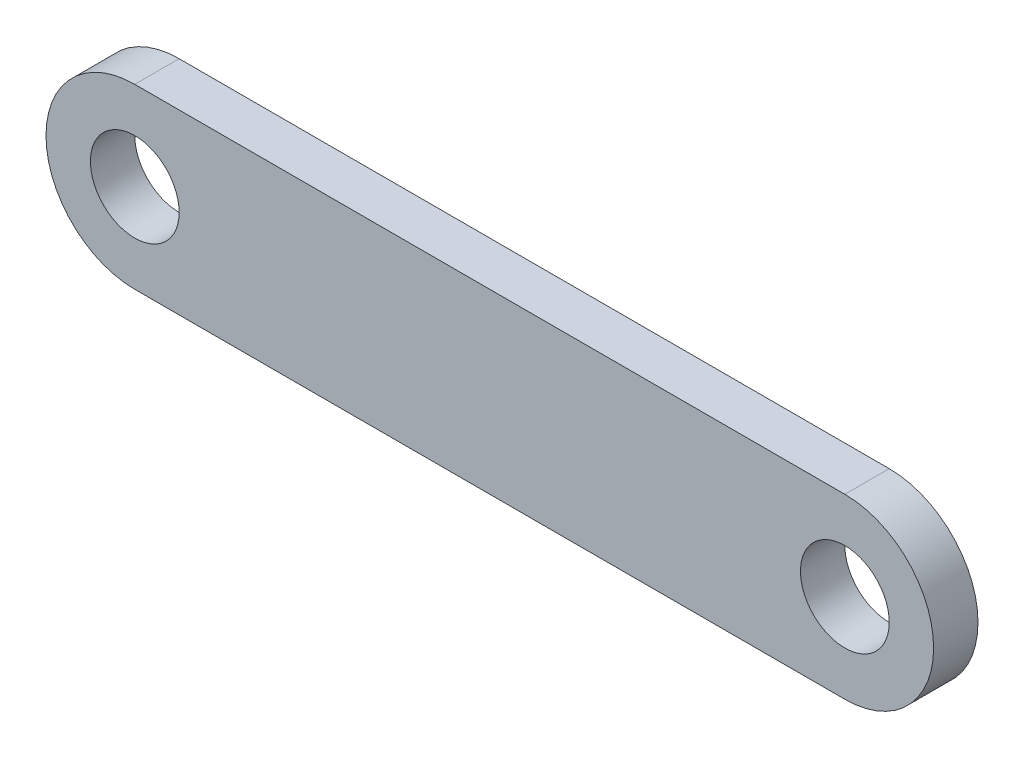
ISO-10303-21;
HEADER;
FILE_DESCRIPTION(('STEP AP214'),'2;1');
FILE_NAME('part.step','',(''),(''),'','','');
FILE_SCHEMA(('AUTOMOTIVE_DESIGN { 1 0 10303 214 1 1 1 1 }'));
ENDSEC;
DATA;
#1=APPLICATION_CONTEXT('core data for automotive mechanical design processes');
#2=APPLICATION_PROTOCOL_DEFINITION('international standard','automotive_design',2000,#1);
#3=PRODUCT_CONTEXT('',#1,'mechanical');
#4=PRODUCT('Part','Part','',(#3));
#5=PRODUCT_RELATED_PRODUCT_CATEGORY('part','',(#4));
#6=PRODUCT_DEFINITION_FORMATION('','',#4);
#7=PRODUCT_DEFINITION_CONTEXT('part definition',#1,'design');
#8=PRODUCT_DEFINITION('design','',#6,#7);
#9=PRODUCT_DEFINITION_SHAPE('','',#8);
#10=(LENGTH_UNIT() NAMED_UNIT(*) SI_UNIT(.MILLI.,.METRE.));
#11=(NAMED_UNIT(*) PLANE_ANGLE_UNIT() SI_UNIT($,.RADIAN.));
#12=(NAMED_UNIT(*) SI_UNIT($,.STERADIAN.) SOLID_ANGLE_UNIT());
#13=UNCERTAINTY_MEASURE_WITH_UNIT(LENGTH_MEASURE(1.E-05),#10,'distance_accuracy_value','');
#14=(GEOMETRIC_REPRESENTATION_CONTEXT(3) GLOBAL_UNCERTAINTY_ASSIGNED_CONTEXT((#13)) GLOBAL_UNIT_ASSIGNED_CONTEXT((#10,
#11,#12)) REPRESENTATION_CONTEXT('',''));
#15=CARTESIAN_POINT('',(0.,0.,0.));
#16=DIRECTION('',(0.,0.,1.));
#17=DIRECTION('',(1.,0.,0.));
#18=AXIS2_PLACEMENT_3D('',#15,#16,#17);
#19=CARTESIAN_POINT('',(0.,0.,1.));
#20=DIRECTION('',(0.,0.,1.));
#21=DIRECTION('',(1.,0.,0.));
#22=AXIS2_PLACEMENT_3D('',#19,#20,#21);
#23=PLANE('',#22);
#24=CARTESIAN_POINT('',(0.,0.,1.));
#25=DIRECTION('',(0.,0.,1.));
#26=DIRECTION('',(1.,0.,0.));
#27=AXIS2_PLACEMENT_3D('',#24,#25,#26);
#28=CIRCLE('',#27,2.);
#29=CARTESIAN_POINT('',(2.,0.,1.));
#30=VERTEX_POINT('',#29);
#31=EDGE_CURVE('E99',#30,#30,#28,.T.);
#32=ORIENTED_EDGE('',*,*,#31,.F.);
#33=EDGE_LOOP('',(#32));
#34=FACE_BOUND('',#33,.T.);
#35=CARTESIAN_POINT('',(0.,0.,1.));
#36=DIRECTION('',(0.,0.,1.));
#37=DIRECTION('',(1.,0.,0.));
#38=AXIS2_PLACEMENT_3D('',#35,#36,#37);
#39=CIRCLE('',#38,4.);
#40=CARTESIAN_POINT('',(0.,4.,1.));
#41=VERTEX_POINT('',#40);
#42=CARTESIAN_POINT('',(0.,-4.,1.));
#43=VERTEX_POINT('',#42);
#44=EDGE_CURVE('E84',#41,#43,#39,.T.);
#45=ORIENTED_EDGE('',*,*,#44,.T.);
#46=DIRECTION('',(1.,0.,0.));
#47=VECTOR('',#46,1.);
#48=CARTESIAN_POINT('',(0.,-4.,1.));
#49=LINE('',#48,#47);
#50=CARTESIAN_POINT('',(32.,-4.,1.));
#51=VERTEX_POINT('',#50);
#52=EDGE_CURVE('E79',#43,#51,#49,.T.);
#53=ORIENTED_EDGE('',*,*,#52,.T.);
#54=CARTESIAN_POINT('',(32.,0.,1.));
#55=DIRECTION('',(0.,0.,1.));
#56=DIRECTION('',(1.,0.,0.));
#57=AXIS2_PLACEMENT_3D('',#54,#55,#56);
#58=CIRCLE('',#57,4.);
#59=CARTESIAN_POINT('',(32.,4.,1.));
#60=VERTEX_POINT('',#59);
#61=EDGE_CURVE('E82',#51,#60,#58,.T.);
#62=ORIENTED_EDGE('',*,*,#61,.T.);
#63=DIRECTION('',(-1.,0.,0.));
#64=VECTOR('',#63,1.);
#65=CARTESIAN_POINT('',(0.,4.,1.));
#66=LINE('',#65,#64);
#67=EDGE_CURVE('E49',#60,#41,#66,.T.);
#68=ORIENTED_EDGE('',*,*,#67,.T.);
#69=EDGE_LOOP('',(#45,#53,#62,#68));
#70=FACE_BOUND('',#69,.T.);
#71=CARTESIAN_POINT('',(32.,0.,1.));
#72=DIRECTION('',(0.,0.,1.));
#73=DIRECTION('',(1.,0.,0.));
#74=AXIS2_PLACEMENT_3D('',#71,#72,#73);
#75=CIRCLE('',#74,2.);
#76=CARTESIAN_POINT('',(34.,0.,1.));
#77=VERTEX_POINT('',#76);
#78=EDGE_CURVE('E114',#77,#77,#75,.T.);
#79=ORIENTED_EDGE('',*,*,#78,.F.);
#80=EDGE_LOOP('',(#79));
#81=FACE_BOUND('',#80,.T.);
#82=ADVANCED_FACE('F32',(#34,#70,#81),#23,.T.);
#83=CARTESIAN_POINT('',(0.,0.,-1.));
#84=DIRECTION('',(0.,0.,1.));
#85=DIRECTION('',(1.,0.,0.));
#86=AXIS2_PLACEMENT_3D('',#83,#84,#85);
#87=PLANE('',#86);
#88=CARTESIAN_POINT('',(0.,0.,-1.));
#89=DIRECTION('',(0.,0.,1.));
#90=DIRECTION('',(1.,0.,0.));
#91=AXIS2_PLACEMENT_3D('',#88,#89,#90);
#92=CIRCLE('',#91,4.);
#93=CARTESIAN_POINT('',(0.,4.,-1.));
#94=VERTEX_POINT('',#93);
#95=CARTESIAN_POINT('',(0.,-4.,-1.));
#96=VERTEX_POINT('',#95);
#97=EDGE_CURVE('E96',#94,#96,#92,.T.);
#98=ORIENTED_EDGE('',*,*,#97,.F.);
#99=DIRECTION('',(-1.,0.,0.));
#100=VECTOR('',#99,1.);
#101=CARTESIAN_POINT('',(0.,4.,-1.));
#102=LINE('',#101,#100);
#103=CARTESIAN_POINT('',(32.,4.,-1.));
#104=VERTEX_POINT('',#103);
#105=EDGE_CURVE('E72',#104,#94,#102,.T.);
#106=ORIENTED_EDGE('',*,*,#105,.F.);
#107=CARTESIAN_POINT('',(32.,0.,-1.));
#108=DIRECTION('',(0.,0.,1.));
#109=DIRECTION('',(1.,0.,0.));
#110=AXIS2_PLACEMENT_3D('',#107,#108,#109);
#111=CIRCLE('',#110,4.);
#112=CARTESIAN_POINT('',(32.,-4.,-1.));
#113=VERTEX_POINT('',#112);
#114=EDGE_CURVE('E66',#113,#104,#111,.T.);
#115=ORIENTED_EDGE('',*,*,#114,.F.);
#116=DIRECTION('',(1.,0.,0.));
#117=VECTOR('',#116,1.);
#118=CARTESIAN_POINT('',(0.,-4.,-1.));
#119=LINE('',#118,#117);
#120=EDGE_CURVE('E88',#96,#113,#119,.T.);
#121=ORIENTED_EDGE('',*,*,#120,.F.);
#122=EDGE_LOOP('',(#98,#106,#115,#121));
#123=FACE_BOUND('',#122,.T.);
#124=CARTESIAN_POINT('',(0.,0.,-1.));
#125=DIRECTION('',(0.,0.,1.));
#126=DIRECTION('',(1.,0.,0.));
#127=AXIS2_PLACEMENT_3D('',#124,#125,#126);
#128=CIRCLE('',#127,2.);
#129=CARTESIAN_POINT('',(2.,0.,-1.));
#130=VERTEX_POINT('',#129);
#131=EDGE_CURVE('E111',#130,#130,#128,.T.);
#132=ORIENTED_EDGE('',*,*,#131,.T.);
#133=EDGE_LOOP('',(#132));
#134=FACE_BOUND('',#133,.T.);
#135=CARTESIAN_POINT('',(32.,0.,-1.));
#136=DIRECTION('',(0.,0.,1.));
#137=DIRECTION('',(1.,0.,0.));
#138=AXIS2_PLACEMENT_3D('',#135,#136,#137);
#139=CIRCLE('',#138,2.);
#140=CARTESIAN_POINT('',(34.,0.,-1.));
#141=VERTEX_POINT('',#140);
#142=EDGE_CURVE('E117',#141,#141,#139,.T.);
#143=ORIENTED_EDGE('',*,*,#142,.T.);
#144=EDGE_LOOP('',(#143));
#145=FACE_BOUND('',#144,.T.);
#146=ADVANCED_FACE('F107',(#123,#134,#145),#87,.F.);
#147=CARTESIAN_POINT('',(0.,0.,1.));
#148=DIRECTION('',(0.,0.,-1.));
#149=DIRECTION('',(-1.,0.,0.));
#150=AXIS2_PLACEMENT_3D('',#147,#148,#149);
#151=CYLINDRICAL_SURFACE('',#150,4.);
#152=ORIENTED_EDGE('',*,*,#97,.T.);
#153=DIRECTION('',(0.,0.,-1.));
#154=VECTOR('',#153,1.);
#155=CARTESIAN_POINT('',(0.,-4.,1.));
#156=LINE('',#155,#154);
#157=EDGE_CURVE('E11',#43,#96,#156,.T.);
#158=ORIENTED_EDGE('',*,*,#157,.F.);
#159=ORIENTED_EDGE('',*,*,#44,.F.);
#160=DIRECTION('',(0.,0.,-1.));
#161=VECTOR('',#160,1.);
#162=CARTESIAN_POINT('',(0.,4.,1.));
#163=LINE('',#162,#161);
#164=EDGE_CURVE('E92',#41,#94,#163,.T.);
#165=ORIENTED_EDGE('',*,*,#164,.T.);
#166=EDGE_LOOP('',(#152,#158,#159,#165));
#167=FACE_BOUND('',#166,.T.);
#168=ADVANCED_FACE('F34',(#167),#151,.T.);
#169=CARTESIAN_POINT('',(0.,-4.,1.));
#170=DIRECTION('',(0.,1.,0.));
#171=DIRECTION('',(0.,0.,1.));
#172=AXIS2_PLACEMENT_3D('',#169,#170,#171);
#173=PLANE('',#172);
#174=ORIENTED_EDGE('',*,*,#120,.T.);
#175=DIRECTION('',(0.,0.,-1.));
#176=VECTOR('',#175,1.);
#177=CARTESIAN_POINT('',(32.,-4.,1.));
#178=LINE('',#177,#176);
#179=EDGE_CURVE('E41',#51,#113,#178,.T.);
#180=ORIENTED_EDGE('',*,*,#179,.F.);
#181=ORIENTED_EDGE('',*,*,#52,.F.);
#182=ORIENTED_EDGE('',*,*,#157,.T.);
#183=EDGE_LOOP('',(#174,#180,#181,#182));
#184=FACE_BOUND('',#183,.T.);
#185=ADVANCED_FACE('F87',(#184),#173,.F.);
#186=CARTESIAN_POINT('',(32.,0.,1.));
#187=DIRECTION('',(0.,0.,-1.));
#188=DIRECTION('',(-1.,0.,0.));
#189=AXIS2_PLACEMENT_3D('',#186,#187,#188);
#190=CYLINDRICAL_SURFACE('',#189,4.);
#191=ORIENTED_EDGE('',*,*,#114,.T.);
#192=DIRECTION('',(0.,0.,-1.));
#193=VECTOR('',#192,1.);
#194=CARTESIAN_POINT('',(32.,4.,1.));
#195=LINE('',#194,#193);
#196=EDGE_CURVE('E89',#60,#104,#195,.T.);
#197=ORIENTED_EDGE('',*,*,#196,.F.);
#198=ORIENTED_EDGE('',*,*,#61,.F.);
#199=ORIENTED_EDGE('',*,*,#179,.T.);
#200=EDGE_LOOP('',(#191,#197,#198,#199));
#201=FACE_BOUND('',#200,.T.);
#202=ADVANCED_FACE('F90',(#201),#190,.T.);
#203=CARTESIAN_POINT('',(0.,4.,1.));
#204=DIRECTION('',(0.,-1.,0.));
#205=DIRECTION('',(0.,0.,-1.));
#206=AXIS2_PLACEMENT_3D('',#203,#204,#205);
#207=PLANE('',#206);
#208=ORIENTED_EDGE('',*,*,#105,.T.);
#209=ORIENTED_EDGE('',*,*,#164,.F.);
#210=ORIENTED_EDGE('',*,*,#67,.F.);
#211=ORIENTED_EDGE('',*,*,#196,.T.);
#212=EDGE_LOOP('',(#208,#209,#210,#211));
#213=FACE_BOUND('',#212,.T.);
#214=ADVANCED_FACE('F104',(#213),#207,.F.);
#215=CARTESIAN_POINT('',(0.,0.,1.));
#216=DIRECTION('',(0.,0.,-1.));
#217=DIRECTION('',(-1.,0.,0.));
#218=AXIS2_PLACEMENT_3D('',#215,#216,#217);
#219=CYLINDRICAL_SURFACE('',#218,2.);
#220=ORIENTED_EDGE('',*,*,#31,.T.);
#221=EDGE_LOOP('',(#220));
#222=FACE_BOUND('',#221,.T.);
#223=ORIENTED_EDGE('',*,*,#131,.F.);
#224=EDGE_LOOP('',(#223));
#225=FACE_BOUND('',#224,.T.);
#226=ADVANCED_FACE('F134',(#222,#225),#219,.F.);
#227=CARTESIAN_POINT('',(32.,0.,1.));
#228=DIRECTION('',(0.,0.,-1.));
#229=DIRECTION('',(-1.,0.,0.));
#230=AXIS2_PLACEMENT_3D('',#227,#228,#229);
#231=CYLINDRICAL_SURFACE('',#230,2.);
#232=ORIENTED_EDGE('',*,*,#78,.T.);
#233=EDGE_LOOP('',(#232));
#234=FACE_BOUND('',#233,.T.);
#235=ORIENTED_EDGE('',*,*,#142,.F.);
#236=EDGE_LOOP('',(#235));
#237=FACE_BOUND('',#236,.T.);
#238=ADVANCED_FACE('F123',(#234,#237),#231,.F.);
#239=CLOSED_SHELL('',(#82,#146,#168,#185,#202,#214,#226,#238));
#240=MANIFOLD_SOLID_BREP('B2',#239);
#241=ADVANCED_BREP_SHAPE_REPRESENTATION('',(#18,#240),#14);
#242=SHAPE_DEFINITION_REPRESENTATION(#9,#241);
ENDSEC;
END-ISO-10303-21;
